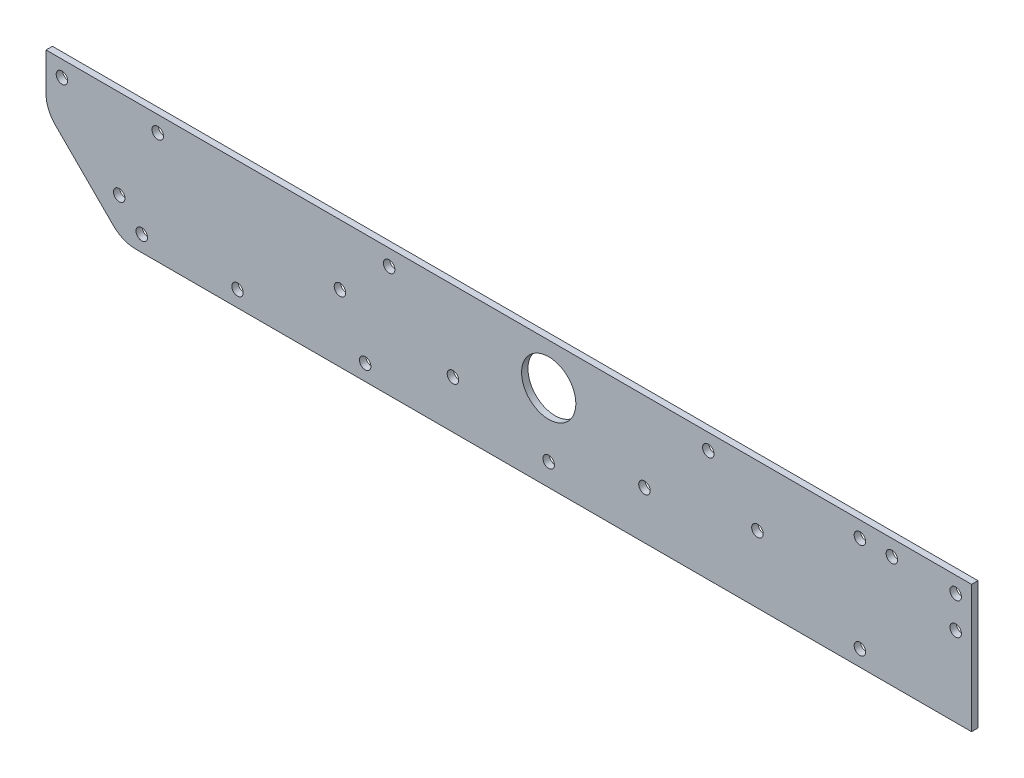
ISO-10303-21;
HEADER;
FILE_DESCRIPTION(('STEP AP214'),'2;1');
FILE_NAME('part.step','',(''),(''),'','','');
FILE_SCHEMA(('AUTOMOTIVE_DESIGN { 1 0 10303 214 1 1 1 1 }'));
ENDSEC;
DATA;
#1=APPLICATION_CONTEXT('core data for automotive mechanical design processes');
#2=APPLICATION_PROTOCOL_DEFINITION('international standard','automotive_design',2000,#1);
#3=PRODUCT_CONTEXT('',#1,'mechanical');
#4=PRODUCT('Part','Part','',(#3));
#5=PRODUCT_RELATED_PRODUCT_CATEGORY('part','',(#4));
#6=PRODUCT_DEFINITION_FORMATION('','',#4);
#7=PRODUCT_DEFINITION_CONTEXT('part definition',#1,'design');
#8=PRODUCT_DEFINITION('design','',#6,#7);
#9=PRODUCT_DEFINITION_SHAPE('','',#8);
#10=(LENGTH_UNIT() NAMED_UNIT(*) SI_UNIT(.MILLI.,.METRE.));
#11=(NAMED_UNIT(*) PLANE_ANGLE_UNIT() SI_UNIT($,.RADIAN.));
#12=(NAMED_UNIT(*) SI_UNIT($,.STERADIAN.) SOLID_ANGLE_UNIT());
#13=UNCERTAINTY_MEASURE_WITH_UNIT(LENGTH_MEASURE(1.E-05),#10,'distance_accuracy_value','');
#14=(GEOMETRIC_REPRESENTATION_CONTEXT(3) GLOBAL_UNCERTAINTY_ASSIGNED_CONTEXT((#13)) GLOBAL_UNIT_ASSIGNED_CONTEXT((#10,
#11,#12)) REPRESENTATION_CONTEXT('',''));
#15=CARTESIAN_POINT('',(0.,0.,0.));
#16=DIRECTION('',(0.,0.,1.));
#17=DIRECTION('',(1.,0.,0.));
#18=AXIS2_PLACEMENT_3D('',#15,#16,#17);
#19=CARTESIAN_POINT('',(0.,0.,2.54));
#20=DIRECTION('',(0.,0.,1.));
#21=DIRECTION('',(1.,0.,0.));
#22=AXIS2_PLACEMENT_3D('',#19,#20,#21);
#23=PLANE('',#22);
#24=CARTESIAN_POINT('',(-44.45,44.45,2.54));
#25=DIRECTION('',(0.,0.,1.));
#26=DIRECTION('',(1.,0.,0.));
#27=AXIS2_PLACEMENT_3D('',#24,#25,#26);
#28=CIRCLE('',#27,2.286);
#29=CARTESIAN_POINT('',(-42.164,44.45,2.54));
#30=VERTEX_POINT('',#29);
#31=EDGE_CURVE('E495',#30,#30,#28,.T.);
#32=ORIENTED_EDGE('',*,*,#31,.F.);
#33=EDGE_LOOP('',(#32));
#34=FACE_BOUND('',#33,.T.);
#35=CARTESIAN_POINT('',(-31.75,44.45,2.54));
#36=DIRECTION('',(0.,0.,1.));
#37=DIRECTION('',(1.,0.,0.));
#38=AXIS2_PLACEMENT_3D('',#35,#36,#37);
#39=CIRCLE('',#38,2.286);
#40=CARTESIAN_POINT('',(-29.464,44.45,2.54));
#41=VERTEX_POINT('',#40);
#42=EDGE_CURVE('E496',#41,#41,#39,.T.);
#43=ORIENTED_EDGE('',*,*,#42,.F.);
#44=EDGE_LOOP('',(#43));
#45=FACE_BOUND('',#44,.T.);
#46=CARTESIAN_POINT('',(-6.35,44.45,2.54));
#47=DIRECTION('',(0.,0.,1.));
#48=DIRECTION('',(1.,0.,0.));
#49=AXIS2_PLACEMENT_3D('',#46,#47,#48);
#50=CIRCLE('',#49,2.286);
#51=CARTESIAN_POINT('',(-4.064,44.45,2.54));
#52=VERTEX_POINT('',#51);
#53=EDGE_CURVE('E506',#52,#52,#50,.T.);
#54=ORIENTED_EDGE('',*,*,#53,.F.);
#55=EDGE_LOOP('',(#54));
#56=FACE_BOUND('',#55,.T.);
#57=CARTESIAN_POINT('',(-6.35,31.75,2.54));
#58=DIRECTION('',(0.,0.,1.));
#59=DIRECTION('',(1.,0.,0.));
#60=AXIS2_PLACEMENT_3D('',#57,#58,#59);
#61=CIRCLE('',#60,2.286);
#62=CARTESIAN_POINT('',(-4.064,31.75,2.54));
#63=VERTEX_POINT('',#62);
#64=EDGE_CURVE('E512',#63,#63,#61,.T.);
#65=ORIENTED_EDGE('',*,*,#64,.F.);
#66=EDGE_LOOP('',(#65));
#67=FACE_BOUND('',#66,.T.);
#68=CARTESIAN_POINT('',(-104.775,44.45,2.54));
#69=DIRECTION('',(0.,0.,1.));
#70=DIRECTION('',(1.,0.,0.));
#71=AXIS2_PLACEMENT_3D('',#68,#69,#70);
#72=CIRCLE('',#71,2.28599999999999);
#73=CARTESIAN_POINT('',(-102.489,44.45,2.54));
#74=VERTEX_POINT('',#73);
#75=EDGE_CURVE('E520',#74,#74,#72,.T.);
#76=ORIENTED_EDGE('',*,*,#75,.F.);
#77=EDGE_LOOP('',(#76));
#78=FACE_BOUND('',#77,.T.);
#79=CARTESIAN_POINT('',(-231.775,44.45,2.54));
#80=DIRECTION('',(0.,0.,1.));
#81=DIRECTION('',(1.,0.,0.));
#82=AXIS2_PLACEMENT_3D('',#79,#80,#81);
#83=CIRCLE('',#82,2.28600000000001);
#84=CARTESIAN_POINT('',(-229.489,44.45,2.54));
#85=VERTEX_POINT('',#84);
#86=EDGE_CURVE('E523',#85,#85,#83,.T.);
#87=ORIENTED_EDGE('',*,*,#86,.F.);
#88=EDGE_LOOP('',(#87));
#89=FACE_BOUND('',#88,.T.);
#90=CARTESIAN_POINT('',(-168.275,8.89000000000002,2.54));
#91=DIRECTION('',(0.,0.,1.));
#92=DIRECTION('',(1.,0.,0.));
#93=AXIS2_PLACEMENT_3D('',#90,#91,#92);
#94=CIRCLE('',#93,2.28600000000001);
#95=CARTESIAN_POINT('',(-165.989,8.89000000000002,2.54));
#96=VERTEX_POINT('',#95);
#97=EDGE_CURVE('E529',#96,#96,#94,.T.);
#98=ORIENTED_EDGE('',*,*,#97,.F.);
#99=EDGE_LOOP('',(#98));
#100=FACE_BOUND('',#99,.T.);
#101=DIRECTION('',(-0.707106781186547,0.707106781186548,0.));
#102=VECTOR('',#101,1.);
#103=CARTESIAN_POINT('',(-388.62,50.8,2.54));
#104=LINE('',#103,#102);
#105=CARTESIAN_POINT('',(-341.539743878931,3.71974387893083,2.54));
#106=VERTEX_POINT('',#105);
#107=CARTESIAN_POINT('',(-364.580256121069,26.7602561210692,2.54));
#108=VERTEX_POINT('',#107);
#109=EDGE_CURVE('E151',#106,#108,#104,.T.);
#110=ORIENTED_EDGE('',*,*,#109,.F.);
#111=CARTESIAN_POINT('',(-332.559487757862,12.7,2.54));
#112=DIRECTION('',(0.,0.,1.));
#113=DIRECTION('',(1.,0.,0.));
#114=AXIS2_PLACEMENT_3D('',#111,#112,#113);
#115=CIRCLE('',#114,12.7);
#116=CARTESIAN_POINT('',(-332.559487757862,0.,2.54));
#117=VERTEX_POINT('',#116);
#118=EDGE_CURVE('E136',#106,#117,#115,.T.);
#119=ORIENTED_EDGE('',*,*,#118,.T.);
#120=DIRECTION('',(1.,0.,0.));
#121=VECTOR('',#120,1.);
#122=CARTESIAN_POINT('',(0.,0.,2.54));
#123=LINE('',#122,#121);
#124=CARTESIAN_POINT('',(0.,0.,2.54));
#125=VERTEX_POINT('',#124);
#126=EDGE_CURVE('E115',#117,#125,#123,.T.);
#127=ORIENTED_EDGE('',*,*,#126,.T.);
#128=DIRECTION('',(0.,1.,0.));
#129=VECTOR('',#128,1.);
#130=CARTESIAN_POINT('',(0.,0.,2.54));
#131=LINE('',#130,#129);
#132=CARTESIAN_POINT('',(-1.05408619169834E-12,50.8,2.54));
#133=VERTEX_POINT('',#132);
#134=EDGE_CURVE('E110',#125,#133,#131,.T.);
#135=ORIENTED_EDGE('',*,*,#134,.T.);
#136=DIRECTION('',(-1.,0.,0.));
#137=VECTOR('',#136,1.);
#138=CARTESIAN_POINT('',(-1.05408619169834E-12,50.8,2.54));
#139=LINE('',#138,#137);
#140=CARTESIAN_POINT('',(-368.3,50.8,2.54));
#141=VERTEX_POINT('',#140);
#142=EDGE_CURVE('E98',#133,#141,#139,.T.);
#143=ORIENTED_EDGE('',*,*,#142,.T.);
#144=DIRECTION('',(0.,-1.,0.));
#145=VECTOR('',#144,1.);
#146=CARTESIAN_POINT('',(-368.3,0.,2.54));
#147=LINE('',#146,#145);
#148=CARTESIAN_POINT('',(-368.3,35.7405122421383,2.54));
#149=VERTEX_POINT('',#148);
#150=EDGE_CURVE('E109',#141,#149,#147,.T.);
#151=ORIENTED_EDGE('',*,*,#150,.T.);
#152=CARTESIAN_POINT('',(-355.6,35.7405122421383,2.54));
#153=DIRECTION('',(0.,0.,1.));
#154=DIRECTION('',(1.,0.,0.));
#155=AXIS2_PLACEMENT_3D('',#152,#153,#154);
#156=CIRCLE('',#155,12.7);
#157=EDGE_CURVE('E134',#149,#108,#156,.T.);
#158=ORIENTED_EDGE('',*,*,#157,.T.);
#159=EDGE_LOOP('',(#110,#119,#127,#135,#143,#151,#158));
#160=FACE_BOUND('',#159,.T.);
#161=CARTESIAN_POINT('',(-323.85,44.45,2.54));
#162=DIRECTION('',(0.,0.,1.));
#163=DIRECTION('',(1.,0.,0.));
#164=AXIS2_PLACEMENT_3D('',#161,#162,#163);
#165=CIRCLE('',#164,2.28600000000004);
#166=CARTESIAN_POINT('',(-321.564,44.45,2.54));
#167=VERTEX_POINT('',#166);
#168=EDGE_CURVE('E540',#167,#167,#165,.T.);
#169=ORIENTED_EDGE('',*,*,#168,.F.);
#170=EDGE_LOOP('',(#169));
#171=FACE_BOUND('',#170,.T.);
#172=CARTESIAN_POINT('',(-241.3,6.34999999999999,2.54));
#173=DIRECTION('',(0.,0.,1.));
#174=DIRECTION('',(1.,0.,0.));
#175=AXIS2_PLACEMENT_3D('',#172,#173,#174);
#176=CIRCLE('',#175,2.28600000000004);
#177=CARTESIAN_POINT('',(-239.014,6.34999999999999,2.54));
#178=VERTEX_POINT('',#177);
#179=EDGE_CURVE('E552',#178,#178,#176,.T.);
#180=ORIENTED_EDGE('',*,*,#179,.F.);
#181=EDGE_LOOP('',(#180));
#182=FACE_BOUND('',#181,.T.);
#183=CARTESIAN_POINT('',(-85.217,26.67,2.54));
#184=DIRECTION('',(0.,0.,1.));
#185=DIRECTION('',(-1.,0.,0.));
#186=AXIS2_PLACEMENT_3D('',#183,#184,#185);
#187=CIRCLE('',#186,2.28600000000004);
#188=CARTESIAN_POINT('',(-87.503,26.67,2.54));
#189=VERTEX_POINT('',#188);
#190=EDGE_CURVE('E564',#189,#189,#187,.T.);
#191=ORIENTED_EDGE('',*,*,#190,.F.);
#192=EDGE_LOOP('',(#191));
#193=FACE_BOUND('',#192,.T.);
#194=CARTESIAN_POINT('',(-168.275,34.29,2.54));
#195=DIRECTION('',(0.,0.,1.));
#196=DIRECTION('',(1.,0.,0.));
#197=AXIS2_PLACEMENT_3D('',#194,#195,#196);
#198=CIRCLE('',#197,10.795);
#199=CARTESIAN_POINT('',(-157.48,34.29,2.54));
#200=VERTEX_POINT('',#199);
#201=EDGE_CURVE('E576',#200,#200,#198,.T.);
#202=ORIENTED_EDGE('',*,*,#201,.F.);
#203=EDGE_LOOP('',(#202));
#204=FACE_BOUND('',#203,.T.);
#205=CARTESIAN_POINT('',(-292.1,6.34999999999999,2.54));
#206=DIRECTION('',(0.,0.,1.));
#207=DIRECTION('',(1.,0.,0.));
#208=AXIS2_PLACEMENT_3D('',#205,#206,#207);
#209=CIRCLE('',#208,2.28600000000004);
#210=CARTESIAN_POINT('',(-289.814,6.34999999999999,2.54));
#211=VERTEX_POINT('',#210);
#212=EDGE_CURVE('E588',#211,#211,#209,.T.);
#213=ORIENTED_EDGE('',*,*,#212,.F.);
#214=EDGE_LOOP('',(#213));
#215=FACE_BOUND('',#214,.T.);
#216=CARTESIAN_POINT('',(-44.45,6.34999999999999,2.54));
#217=DIRECTION('',(0.,0.,1.));
#218=DIRECTION('',(1.,0.,0.));
#219=AXIS2_PLACEMENT_3D('',#216,#217,#218);
#220=CIRCLE('',#219,2.28599999999999);
#221=CARTESIAN_POINT('',(-42.164,6.34999999999999,2.54));
#222=VERTEX_POINT('',#221);
#223=EDGE_CURVE('E160',#222,#222,#220,.T.);
#224=ORIENTED_EDGE('',*,*,#223,.F.);
#225=EDGE_LOOP('',(#224));
#226=FACE_BOUND('',#225,.T.);
#227=CARTESIAN_POINT('',(-206.375,19.050000000001,2.54));
#228=DIRECTION('',(0.,0.,1.));
#229=DIRECTION('',(1.,0.,0.));
#230=AXIS2_PLACEMENT_3D('',#227,#228,#229);
#231=CIRCLE('',#230,2.28600000000001);
#232=CARTESIAN_POINT('',(-204.089,19.050000000001,2.54));
#233=VERTEX_POINT('',#232);
#234=EDGE_CURVE('E594',#233,#233,#231,.T.);
#235=ORIENTED_EDGE('',*,*,#234,.F.);
#236=EDGE_LOOP('',(#235));
#237=FACE_BOUND('',#236,.T.);
#238=CARTESIAN_POINT('',(-130.175,19.050000000001,2.54));
#239=DIRECTION('',(0.,0.,1.));
#240=DIRECTION('',(1.,0.,0.));
#241=AXIS2_PLACEMENT_3D('',#238,#239,#240);
#242=CIRCLE('',#241,2.28600000000001);
#243=CARTESIAN_POINT('',(-127.889,19.050000000001,2.54));
#244=VERTEX_POINT('',#243);
#245=EDGE_CURVE('E582',#244,#244,#242,.T.);
#246=ORIENTED_EDGE('',*,*,#245,.F.);
#247=EDGE_LOOP('',(#246));
#248=FACE_BOUND('',#247,.T.);
#249=CARTESIAN_POINT('',(-251.333,26.67,2.54));
#250=DIRECTION('',(0.,0.,1.));
#251=DIRECTION('',(1.,0.,0.));
#252=AXIS2_PLACEMENT_3D('',#249,#250,#251);
#253=CIRCLE('',#252,2.28600000000004);
#254=CARTESIAN_POINT('',(-249.047,26.67,2.54));
#255=VERTEX_POINT('',#254);
#256=EDGE_CURVE('E570',#255,#255,#253,.T.);
#257=ORIENTED_EDGE('',*,*,#256,.F.);
#258=EDGE_LOOP('',(#257));
#259=FACE_BOUND('',#258,.T.);
#260=CARTESIAN_POINT('',(-361.95,44.45,2.54));
#261=DIRECTION('',(0.,0.,1.));
#262=DIRECTION('',(1.,0.,0.));
#263=AXIS2_PLACEMENT_3D('',#260,#261,#262);
#264=CIRCLE('',#263,2.28600000000004);
#265=CARTESIAN_POINT('',(-359.664,44.45,2.54));
#266=VERTEX_POINT('',#265);
#267=EDGE_CURVE('E558',#266,#266,#264,.T.);
#268=ORIENTED_EDGE('',*,*,#267,.F.);
#269=EDGE_LOOP('',(#268));
#270=FACE_BOUND('',#269,.T.);
#271=CARTESIAN_POINT('',(-330.2,6.3499999999992,2.54));
#272=DIRECTION('',(0.,0.,1.));
#273=DIRECTION('',(1.,0.,0.));
#274=AXIS2_PLACEMENT_3D('',#271,#272,#273);
#275=CIRCLE('',#274,2.28600000000004);
#276=CARTESIAN_POINT('',(-327.914,6.3499999999992,2.54));
#277=VERTEX_POINT('',#276);
#278=EDGE_CURVE('E546',#277,#277,#275,.T.);
#279=ORIENTED_EDGE('',*,*,#278,.F.);
#280=EDGE_LOOP('',(#279));
#281=FACE_BOUND('',#280,.T.);
#282=CARTESIAN_POINT('',(-339.180256121069,15.3302561210692,2.54));
#283=DIRECTION('',(0.,0.,1.));
#284=DIRECTION('',(1.,0.,0.));
#285=AXIS2_PLACEMENT_3D('',#282,#283,#284);
#286=CIRCLE('',#285,2.28600000000004);
#287=CARTESIAN_POINT('',(-336.894256121069,15.3302561210692,2.54));
#288=VERTEX_POINT('',#287);
#289=EDGE_CURVE('E534',#288,#288,#286,.T.);
#290=ORIENTED_EDGE('',*,*,#289,.F.);
#291=EDGE_LOOP('',(#290));
#292=FACE_BOUND('',#291,.T.);
#293=ADVANCED_FACE('F36',(#34,#45,#56,#67,#78,#89,#100,#160,#171,#182,#193,#204,#215,#226,#237,
#248,#259,#270,#281,#292),#23,.T.);
#294=CARTESIAN_POINT('',(0.,0.,0.));
#295=DIRECTION('',(0.,0.,1.));
#296=DIRECTION('',(1.,0.,0.));
#297=AXIS2_PLACEMENT_3D('',#294,#295,#296);
#298=PLANE('',#297);
#299=CARTESIAN_POINT('',(-44.45,44.45,0.));
#300=DIRECTION('',(0.,0.,1.));
#301=DIRECTION('',(1.,0.,0.));
#302=AXIS2_PLACEMENT_3D('',#299,#300,#301);
#303=CIRCLE('',#302,2.286);
#304=CARTESIAN_POINT('',(-42.164,44.45,0.));
#305=VERTEX_POINT('',#304);
#306=EDGE_CURVE('E493',#305,#305,#303,.T.);
#307=ORIENTED_EDGE('',*,*,#306,.T.);
#308=EDGE_LOOP('',(#307));
#309=FACE_BOUND('',#308,.T.);
#310=CARTESIAN_POINT('',(-31.75,44.45,0.));
#311=DIRECTION('',(0.,0.,1.));
#312=DIRECTION('',(1.,0.,0.));
#313=AXIS2_PLACEMENT_3D('',#310,#311,#312);
#314=CIRCLE('',#313,2.286);
#315=CARTESIAN_POINT('',(-29.464,44.45,0.));
#316=VERTEX_POINT('',#315);
#317=EDGE_CURVE('E501',#316,#316,#314,.T.);
#318=ORIENTED_EDGE('',*,*,#317,.T.);
#319=EDGE_LOOP('',(#318));
#320=FACE_BOUND('',#319,.T.);
#321=CARTESIAN_POINT('',(-6.35,44.45,0.));
#322=DIRECTION('',(0.,0.,1.));
#323=DIRECTION('',(1.,0.,0.));
#324=AXIS2_PLACEMENT_3D('',#321,#322,#323);
#325=CIRCLE('',#324,2.286);
#326=CARTESIAN_POINT('',(-4.064,44.45,0.));
#327=VERTEX_POINT('',#326);
#328=EDGE_CURVE('E509',#327,#327,#325,.T.);
#329=ORIENTED_EDGE('',*,*,#328,.T.);
#330=EDGE_LOOP('',(#329));
#331=FACE_BOUND('',#330,.T.);
#332=CARTESIAN_POINT('',(-6.35,31.75,0.));
#333=DIRECTION('',(0.,0.,1.));
#334=DIRECTION('',(1.,0.,0.));
#335=AXIS2_PLACEMENT_3D('',#332,#333,#334);
#336=CIRCLE('',#335,2.286);
#337=CARTESIAN_POINT('',(-4.064,31.75,0.));
#338=VERTEX_POINT('',#337);
#339=EDGE_CURVE('E515',#338,#338,#336,.T.);
#340=ORIENTED_EDGE('',*,*,#339,.T.);
#341=EDGE_LOOP('',(#340));
#342=FACE_BOUND('',#341,.T.);
#343=CARTESIAN_POINT('',(-104.775,44.45,0.));
#344=DIRECTION('',(0.,0.,1.));
#345=DIRECTION('',(1.,0.,0.));
#346=AXIS2_PLACEMENT_3D('',#343,#344,#345);
#347=CIRCLE('',#346,2.28599999999999);
#348=CARTESIAN_POINT('',(-102.489,44.45,0.));
#349=VERTEX_POINT('',#348);
#350=EDGE_CURVE('E168',#349,#349,#347,.T.);
#351=ORIENTED_EDGE('',*,*,#350,.T.);
#352=EDGE_LOOP('',(#351));
#353=FACE_BOUND('',#352,.T.);
#354=CARTESIAN_POINT('',(-231.775,44.45,0.));
#355=DIRECTION('',(0.,0.,1.));
#356=DIRECTION('',(1.,0.,0.));
#357=AXIS2_PLACEMENT_3D('',#354,#355,#356);
#358=CIRCLE('',#357,2.28600000000001);
#359=CARTESIAN_POINT('',(-229.489,44.45,0.));
#360=VERTEX_POINT('',#359);
#361=EDGE_CURVE('E526',#360,#360,#358,.T.);
#362=ORIENTED_EDGE('',*,*,#361,.T.);
#363=EDGE_LOOP('',(#362));
#364=FACE_BOUND('',#363,.T.);
#365=CARTESIAN_POINT('',(-168.275,8.89000000000002,0.));
#366=DIRECTION('',(0.,0.,1.));
#367=DIRECTION('',(1.,0.,0.));
#368=AXIS2_PLACEMENT_3D('',#365,#366,#367);
#369=CIRCLE('',#368,2.28600000000001);
#370=CARTESIAN_POINT('',(-165.989,8.89000000000002,0.));
#371=VERTEX_POINT('',#370);
#372=EDGE_CURVE('E498',#371,#371,#369,.T.);
#373=ORIENTED_EDGE('',*,*,#372,.T.);
#374=EDGE_LOOP('',(#373));
#375=FACE_BOUND('',#374,.T.);
#376=DIRECTION('',(1.,0.,0.));
#377=VECTOR('',#376,1.);
#378=CARTESIAN_POINT('',(0.,0.,0.));
#379=LINE('',#378,#377);
#380=CARTESIAN_POINT('',(-332.559487757862,0.,0.));
#381=VERTEX_POINT('',#380);
#382=CARTESIAN_POINT('',(0.,0.,0.));
#383=VERTEX_POINT('',#382);
#384=EDGE_CURVE('E119',#381,#383,#379,.T.);
#385=ORIENTED_EDGE('',*,*,#384,.F.);
#386=CARTESIAN_POINT('',(-332.559487757862,12.7,0.));
#387=DIRECTION('',(0.,0.,1.));
#388=DIRECTION('',(1.,0.,0.));
#389=AXIS2_PLACEMENT_3D('',#386,#387,#388);
#390=CIRCLE('',#389,12.7);
#391=CARTESIAN_POINT('',(-341.539743878931,3.71974387893083,0.));
#392=VERTEX_POINT('',#391);
#393=EDGE_CURVE('E44',#381,#392,#390,.F.);
#394=ORIENTED_EDGE('',*,*,#393,.T.);
#395=DIRECTION('',(-0.707106781186547,0.707106781186548,0.));
#396=VECTOR('',#395,1.);
#397=CARTESIAN_POINT('',(-388.62,50.8,0.));
#398=LINE('',#397,#396);
#399=CARTESIAN_POINT('',(-364.580256121069,26.7602561210692,0.));
#400=VERTEX_POINT('',#399);
#401=EDGE_CURVE('E143',#392,#400,#398,.T.);
#402=ORIENTED_EDGE('',*,*,#401,.T.);
#403=CARTESIAN_POINT('',(-355.6,35.7405122421383,0.));
#404=DIRECTION('',(0.,0.,1.));
#405=DIRECTION('',(1.,0.,0.));
#406=AXIS2_PLACEMENT_3D('',#403,#404,#405);
#407=CIRCLE('',#406,12.7);
#408=CARTESIAN_POINT('',(-368.3,35.7405122421383,0.));
#409=VERTEX_POINT('',#408);
#410=EDGE_CURVE('E51',#400,#409,#407,.F.);
#411=ORIENTED_EDGE('',*,*,#410,.T.);
#412=DIRECTION('',(0.,-1.,0.));
#413=VECTOR('',#412,1.);
#414=CARTESIAN_POINT('',(-368.3,0.,0.));
#415=LINE('',#414,#413);
#416=CARTESIAN_POINT('',(-368.3,50.8,0.));
#417=VERTEX_POINT('',#416);
#418=EDGE_CURVE('E162',#417,#409,#415,.T.);
#419=ORIENTED_EDGE('',*,*,#418,.F.);
#420=DIRECTION('',(-1.,0.,0.));
#421=VECTOR('',#420,1.);
#422=CARTESIAN_POINT('',(-1.05408619169834E-12,50.8,0.));
#423=LINE('',#422,#421);
#424=CARTESIAN_POINT('',(-1.05408619169834E-12,50.8,0.));
#425=VERTEX_POINT('',#424);
#426=EDGE_CURVE('E159',#425,#417,#423,.T.);
#427=ORIENTED_EDGE('',*,*,#426,.F.);
#428=DIRECTION('',(0.,1.,0.));
#429=VECTOR('',#428,1.);
#430=CARTESIAN_POINT('',(0.,0.,0.));
#431=LINE('',#430,#429);
#432=EDGE_CURVE('E123',#383,#425,#431,.T.);
#433=ORIENTED_EDGE('',*,*,#432,.F.);
#434=EDGE_LOOP('',(#385,#394,#402,#411,#419,#427,#433));
#435=FACE_BOUND('',#434,.T.);
#436=CARTESIAN_POINT('',(-44.45,6.34999999999999,0.));
#437=DIRECTION('',(0.,0.,1.));
#438=DIRECTION('',(1.,0.,0.));
#439=AXIS2_PLACEMENT_3D('',#436,#437,#438);
#440=CIRCLE('',#439,2.28599999999999);
#441=CARTESIAN_POINT('',(-42.164,6.34999999999999,0.));
#442=VERTEX_POINT('',#441);
#443=EDGE_CURVE('E597',#442,#442,#440,.T.);
#444=ORIENTED_EDGE('',*,*,#443,.T.);
#445=EDGE_LOOP('',(#444));
#446=FACE_BOUND('',#445,.T.);
#447=CARTESIAN_POINT('',(-206.375,19.050000000001,0.));
#448=DIRECTION('',(0.,0.,1.));
#449=DIRECTION('',(1.,0.,0.));
#450=AXIS2_PLACEMENT_3D('',#447,#448,#449);
#451=CIRCLE('',#450,2.28600000000001);
#452=CARTESIAN_POINT('',(-204.089,19.050000000001,0.));
#453=VERTEX_POINT('',#452);
#454=EDGE_CURVE('E591',#453,#453,#451,.T.);
#455=ORIENTED_EDGE('',*,*,#454,.T.);
#456=EDGE_LOOP('',(#455));
#457=FACE_BOUND('',#456,.T.);
#458=CARTESIAN_POINT('',(-292.1,6.34999999999999,0.));
#459=DIRECTION('',(0.,0.,1.));
#460=DIRECTION('',(1.,0.,0.));
#461=AXIS2_PLACEMENT_3D('',#458,#459,#460);
#462=CIRCLE('',#461,2.28600000000004);
#463=CARTESIAN_POINT('',(-289.814,6.34999999999999,0.));
#464=VERTEX_POINT('',#463);
#465=EDGE_CURVE('E585',#464,#464,#462,.T.);
#466=ORIENTED_EDGE('',*,*,#465,.T.);
#467=EDGE_LOOP('',(#466));
#468=FACE_BOUND('',#467,.T.);
#469=CARTESIAN_POINT('',(-130.175,19.050000000001,0.));
#470=DIRECTION('',(0.,0.,1.));
#471=DIRECTION('',(1.,0.,0.));
#472=AXIS2_PLACEMENT_3D('',#469,#470,#471);
#473=CIRCLE('',#472,2.28600000000001);
#474=CARTESIAN_POINT('',(-127.889,19.050000000001,0.));
#475=VERTEX_POINT('',#474);
#476=EDGE_CURVE('E579',#475,#475,#473,.T.);
#477=ORIENTED_EDGE('',*,*,#476,.T.);
#478=EDGE_LOOP('',(#477));
#479=FACE_BOUND('',#478,.T.);
#480=CARTESIAN_POINT('',(-168.275,34.29,0.));
#481=DIRECTION('',(0.,0.,1.));
#482=DIRECTION('',(1.,0.,0.));
#483=AXIS2_PLACEMENT_3D('',#480,#481,#482);
#484=CIRCLE('',#483,10.795);
#485=CARTESIAN_POINT('',(-157.48,34.29,0.));
#486=VERTEX_POINT('',#485);
#487=EDGE_CURVE('E573',#486,#486,#484,.T.);
#488=ORIENTED_EDGE('',*,*,#487,.T.);
#489=EDGE_LOOP('',(#488));
#490=FACE_BOUND('',#489,.T.);
#491=CARTESIAN_POINT('',(-251.333,26.67,0.));
#492=DIRECTION('',(0.,0.,1.));
#493=DIRECTION('',(1.,0.,0.));
#494=AXIS2_PLACEMENT_3D('',#491,#492,#493);
#495=CIRCLE('',#494,2.28600000000004);
#496=CARTESIAN_POINT('',(-249.047,26.67,0.));
#497=VERTEX_POINT('',#496);
#498=EDGE_CURVE('E567',#497,#497,#495,.T.);
#499=ORIENTED_EDGE('',*,*,#498,.T.);
#500=EDGE_LOOP('',(#499));
#501=FACE_BOUND('',#500,.T.);
#502=CARTESIAN_POINT('',(-85.217,26.67,0.));
#503=DIRECTION('',(0.,0.,1.));
#504=DIRECTION('',(-1.,0.,0.));
#505=AXIS2_PLACEMENT_3D('',#502,#503,#504);
#506=CIRCLE('',#505,2.28600000000004);
#507=CARTESIAN_POINT('',(-87.503,26.67,0.));
#508=VERTEX_POINT('',#507);
#509=EDGE_CURVE('E561',#508,#508,#506,.T.);
#510=ORIENTED_EDGE('',*,*,#509,.T.);
#511=EDGE_LOOP('',(#510));
#512=FACE_BOUND('',#511,.T.);
#513=CARTESIAN_POINT('',(-361.95,44.45,0.));
#514=DIRECTION('',(0.,0.,1.));
#515=DIRECTION('',(1.,0.,0.));
#516=AXIS2_PLACEMENT_3D('',#513,#514,#515);
#517=CIRCLE('',#516,2.28600000000004);
#518=CARTESIAN_POINT('',(-359.664,44.45,0.));
#519=VERTEX_POINT('',#518);
#520=EDGE_CURVE('E555',#519,#519,#517,.T.);
#521=ORIENTED_EDGE('',*,*,#520,.T.);
#522=EDGE_LOOP('',(#521));
#523=FACE_BOUND('',#522,.T.);
#524=CARTESIAN_POINT('',(-241.3,6.34999999999999,0.));
#525=DIRECTION('',(0.,0.,1.));
#526=DIRECTION('',(1.,0.,0.));
#527=AXIS2_PLACEMENT_3D('',#524,#525,#526);
#528=CIRCLE('',#527,2.28600000000004);
#529=CARTESIAN_POINT('',(-239.014,6.34999999999999,0.));
#530=VERTEX_POINT('',#529);
#531=EDGE_CURVE('E549',#530,#530,#528,.T.);
#532=ORIENTED_EDGE('',*,*,#531,.T.);
#533=EDGE_LOOP('',(#532));
#534=FACE_BOUND('',#533,.T.);
#535=CARTESIAN_POINT('',(-330.2,6.3499999999992,0.));
#536=DIRECTION('',(0.,0.,1.));
#537=DIRECTION('',(1.,0.,0.));
#538=AXIS2_PLACEMENT_3D('',#535,#536,#537);
#539=CIRCLE('',#538,2.28600000000004);
#540=CARTESIAN_POINT('',(-327.914,6.3499999999992,0.));
#541=VERTEX_POINT('',#540);
#542=EDGE_CURVE('E543',#541,#541,#539,.T.);
#543=ORIENTED_EDGE('',*,*,#542,.T.);
#544=EDGE_LOOP('',(#543));
#545=FACE_BOUND('',#544,.T.);
#546=CARTESIAN_POINT('',(-323.85,44.45,0.));
#547=DIRECTION('',(0.,0.,1.));
#548=DIRECTION('',(1.,0.,0.));
#549=AXIS2_PLACEMENT_3D('',#546,#547,#548);
#550=CIRCLE('',#549,2.28600000000004);
#551=CARTESIAN_POINT('',(-321.564,44.45,0.));
#552=VERTEX_POINT('',#551);
#553=EDGE_CURVE('E537',#552,#552,#550,.T.);
#554=ORIENTED_EDGE('',*,*,#553,.T.);
#555=EDGE_LOOP('',(#554));
#556=FACE_BOUND('',#555,.T.);
#557=CARTESIAN_POINT('',(-339.180256121069,15.3302561210692,0.));
#558=DIRECTION('',(0.,0.,1.));
#559=DIRECTION('',(1.,0.,0.));
#560=AXIS2_PLACEMENT_3D('',#557,#558,#559);
#561=CIRCLE('',#560,2.28600000000004);
#562=CARTESIAN_POINT('',(-336.894256121069,15.3302561210692,0.));
#563=VERTEX_POINT('',#562);
#564=EDGE_CURVE('E150',#563,#563,#561,.T.);
#565=ORIENTED_EDGE('',*,*,#564,.T.);
#566=EDGE_LOOP('',(#565));
#567=FACE_BOUND('',#566,.T.);
#568=ADVANCED_FACE('F141',(#309,#320,#331,#342,#353,#364,#375,#435,#446,#457,#468,#479,#490,
#501,#512,#523,#534,#545,#556,#567),#298,.F.);
#569=CARTESIAN_POINT('',(0.,0.,2.54));
#570=DIRECTION('',(-1.,0.,0.));
#571=DIRECTION('',(0.,-1.,0.));
#572=AXIS2_PLACEMENT_3D('',#569,#570,#571);
#573=PLANE('',#572);
#574=ORIENTED_EDGE('',*,*,#432,.T.);
#575=DIRECTION('',(0.,0.,-1.));
#576=VECTOR('',#575,1.);
#577=CARTESIAN_POINT('',(-1.05408619169834E-12,50.8,2.54));
#578=LINE('',#577,#576);
#579=EDGE_CURVE('E102',#133,#425,#578,.T.);
#580=ORIENTED_EDGE('',*,*,#579,.F.);
#581=ORIENTED_EDGE('',*,*,#134,.F.);
#582=DIRECTION('',(0.,0.,-1.));
#583=VECTOR('',#582,1.);
#584=CARTESIAN_POINT('',(0.,0.,2.54));
#585=LINE('',#584,#583);
#586=EDGE_CURVE('E128',#125,#383,#585,.T.);
#587=ORIENTED_EDGE('',*,*,#586,.T.);
#588=EDGE_LOOP('',(#574,#580,#581,#587));
#589=FACE_BOUND('',#588,.T.);
#590=ADVANCED_FACE('F121',(#589),#573,.F.);
#591=CARTESIAN_POINT('',(-1.05408619169834E-12,50.8,2.54));
#592=DIRECTION('',(0.,-1.,0.));
#593=DIRECTION('',(1.,0.,0.));
#594=AXIS2_PLACEMENT_3D('',#591,#592,#593);
#595=PLANE('',#594);
#596=ORIENTED_EDGE('',*,*,#426,.T.);
#597=DIRECTION('',(0.,0.,-1.));
#598=VECTOR('',#597,1.);
#599=CARTESIAN_POINT('',(-368.3,50.8,2.54));
#600=LINE('',#599,#598);
#601=EDGE_CURVE('E105',#141,#417,#600,.T.);
#602=ORIENTED_EDGE('',*,*,#601,.F.);
#603=ORIENTED_EDGE('',*,*,#142,.F.);
#604=ORIENTED_EDGE('',*,*,#579,.T.);
#605=EDGE_LOOP('',(#596,#602,#603,#604));
#606=FACE_BOUND('',#605,.T.);
#607=ADVANCED_FACE('F100',(#606),#595,.F.);
#608=CARTESIAN_POINT('',(-368.3,0.,2.54));
#609=DIRECTION('',(1.,0.,0.));
#610=DIRECTION('',(0.,0.,-1.));
#611=AXIS2_PLACEMENT_3D('',#608,#609,#610);
#612=PLANE('',#611);
#613=ORIENTED_EDGE('',*,*,#418,.T.);
#614=DIRECTION('',(0.,0.,1.));
#615=VECTOR('',#614,1.);
#616=CARTESIAN_POINT('',(-368.3,35.7405122421383,2.54));
#617=LINE('',#616,#615);
#618=EDGE_CURVE('E11',#409,#149,#617,.T.);
#619=ORIENTED_EDGE('',*,*,#618,.T.);
#620=ORIENTED_EDGE('',*,*,#150,.F.);
#621=ORIENTED_EDGE('',*,*,#601,.T.);
#622=EDGE_LOOP('',(#613,#619,#620,#621));
#623=FACE_BOUND('',#622,.T.);
#624=ADVANCED_FACE('F165',(#623),#612,.F.);
#625=CARTESIAN_POINT('',(0.,0.,2.54));
#626=DIRECTION('',(0.,1.,0.));
#627=DIRECTION('',(-1.,0.,0.));
#628=AXIS2_PLACEMENT_3D('',#625,#626,#627);
#629=PLANE('',#628);
#630=ORIENTED_EDGE('',*,*,#126,.F.);
#631=DIRECTION('',(0.,0.,1.));
#632=VECTOR('',#631,1.);
#633=CARTESIAN_POINT('',(-332.559487757862,0.,2.54));
#634=LINE('',#633,#632);
#635=EDGE_CURVE('E59',#117,#381,#634,.F.);
#636=ORIENTED_EDGE('',*,*,#635,.T.);
#637=ORIENTED_EDGE('',*,*,#384,.T.);
#638=ORIENTED_EDGE('',*,*,#586,.F.);
#639=EDGE_LOOP('',(#630,#636,#637,#638));
#640=FACE_BOUND('',#639,.T.);
#641=ADVANCED_FACE('F154',(#640),#629,.F.);
#642=CARTESIAN_POINT('',(-44.45,6.34999999999999,2.54));
#643=DIRECTION('',(0.,0.,-1.));
#644=DIRECTION('',(-1.,0.,0.));
#645=AXIS2_PLACEMENT_3D('',#642,#643,#644);
#646=CYLINDRICAL_SURFACE('',#645,2.28599999999999);
#647=ORIENTED_EDGE('',*,*,#223,.T.);
#648=EDGE_LOOP('',(#647));
#649=FACE_BOUND('',#648,.T.);
#650=ORIENTED_EDGE('',*,*,#443,.F.);
#651=EDGE_LOOP('',(#650));
#652=FACE_BOUND('',#651,.T.);
#653=ADVANCED_FACE('F190',(#649,#652),#646,.F.);
#654=CARTESIAN_POINT('',(-206.375,19.050000000001,2.54));
#655=DIRECTION('',(0.,0.,-1.));
#656=DIRECTION('',(-1.,0.,0.));
#657=AXIS2_PLACEMENT_3D('',#654,#655,#656);
#658=CYLINDRICAL_SURFACE('',#657,2.28600000000001);
#659=ORIENTED_EDGE('',*,*,#234,.T.);
#660=EDGE_LOOP('',(#659));
#661=FACE_BOUND('',#660,.T.);
#662=ORIENTED_EDGE('',*,*,#454,.F.);
#663=EDGE_LOOP('',(#662));
#664=FACE_BOUND('',#663,.T.);
#665=ADVANCED_FACE('F224',(#661,#664),#658,.F.);
#666=CARTESIAN_POINT('',(-292.1,6.34999999999999,2.54));
#667=DIRECTION('',(0.,0.,-1.));
#668=DIRECTION('',(-1.,0.,0.));
#669=AXIS2_PLACEMENT_3D('',#666,#667,#668);
#670=CYLINDRICAL_SURFACE('',#669,2.28600000000004);
#671=ORIENTED_EDGE('',*,*,#212,.T.);
#672=EDGE_LOOP('',(#671));
#673=FACE_BOUND('',#672,.T.);
#674=ORIENTED_EDGE('',*,*,#465,.F.);
#675=EDGE_LOOP('',(#674));
#676=FACE_BOUND('',#675,.T.);
#677=ADVANCED_FACE('F231',(#673,#676),#670,.F.);
#678=CARTESIAN_POINT('',(-130.175,19.050000000001,2.54));
#679=DIRECTION('',(0.,0.,-1.));
#680=DIRECTION('',(-1.,0.,0.));
#681=AXIS2_PLACEMENT_3D('',#678,#679,#680);
#682=CYLINDRICAL_SURFACE('',#681,2.28600000000001);
#683=ORIENTED_EDGE('',*,*,#245,.T.);
#684=EDGE_LOOP('',(#683));
#685=FACE_BOUND('',#684,.T.);
#686=ORIENTED_EDGE('',*,*,#476,.F.);
#687=EDGE_LOOP('',(#686));
#688=FACE_BOUND('',#687,.T.);
#689=ADVANCED_FACE('F238',(#685,#688),#682,.F.);
#690=CARTESIAN_POINT('',(-168.275,34.29,2.54));
#691=DIRECTION('',(0.,0.,-1.));
#692=DIRECTION('',(-1.,0.,0.));
#693=AXIS2_PLACEMENT_3D('',#690,#691,#692);
#694=CYLINDRICAL_SURFACE('',#693,10.795);
#695=ORIENTED_EDGE('',*,*,#201,.T.);
#696=EDGE_LOOP('',(#695));
#697=FACE_BOUND('',#696,.T.);
#698=ORIENTED_EDGE('',*,*,#487,.F.);
#699=EDGE_LOOP('',(#698));
#700=FACE_BOUND('',#699,.T.);
#701=ADVANCED_FACE('F246',(#697,#700),#694,.F.);
#702=CARTESIAN_POINT('',(-251.333,26.67,2.54));
#703=DIRECTION('',(0.,0.,-1.));
#704=DIRECTION('',(-1.,0.,0.));
#705=AXIS2_PLACEMENT_3D('',#702,#703,#704);
#706=CYLINDRICAL_SURFACE('',#705,2.28600000000004);
#707=ORIENTED_EDGE('',*,*,#256,.T.);
#708=EDGE_LOOP('',(#707));
#709=FACE_BOUND('',#708,.T.);
#710=ORIENTED_EDGE('',*,*,#498,.F.);
#711=EDGE_LOOP('',(#710));
#712=FACE_BOUND('',#711,.T.);
#713=ADVANCED_FACE('F254',(#709,#712),#706,.F.);
#714=CARTESIAN_POINT('',(-85.217,26.67,2.54));
#715=DIRECTION('',(0.,0.,-1.));
#716=DIRECTION('',(-1.,0.,0.));
#717=AXIS2_PLACEMENT_3D('',#714,#715,#716);
#718=CYLINDRICAL_SURFACE('',#717,2.28600000000004);
#719=ORIENTED_EDGE('',*,*,#190,.T.);
#720=EDGE_LOOP('',(#719));
#721=FACE_BOUND('',#720,.T.);
#722=ORIENTED_EDGE('',*,*,#509,.F.);
#723=EDGE_LOOP('',(#722));
#724=FACE_BOUND('',#723,.T.);
#725=ADVANCED_FACE('F262',(#721,#724),#718,.F.);
#726=CARTESIAN_POINT('',(-361.95,44.45,2.54));
#727=DIRECTION('',(0.,0.,-1.));
#728=DIRECTION('',(-1.,0.,0.));
#729=AXIS2_PLACEMENT_3D('',#726,#727,#728);
#730=CYLINDRICAL_SURFACE('',#729,2.28600000000004);
#731=ORIENTED_EDGE('',*,*,#267,.T.);
#732=EDGE_LOOP('',(#731));
#733=FACE_BOUND('',#732,.T.);
#734=ORIENTED_EDGE('',*,*,#520,.F.);
#735=EDGE_LOOP('',(#734));
#736=FACE_BOUND('',#735,.T.);
#737=ADVANCED_FACE('F270',(#733,#736),#730,.F.);
#738=CARTESIAN_POINT('',(-241.3,6.34999999999999,2.54));
#739=DIRECTION('',(0.,0.,-1.));
#740=DIRECTION('',(-1.,0.,0.));
#741=AXIS2_PLACEMENT_3D('',#738,#739,#740);
#742=CYLINDRICAL_SURFACE('',#741,2.28600000000004);
#743=ORIENTED_EDGE('',*,*,#179,.T.);
#744=EDGE_LOOP('',(#743));
#745=FACE_BOUND('',#744,.T.);
#746=ORIENTED_EDGE('',*,*,#531,.F.);
#747=EDGE_LOOP('',(#746));
#748=FACE_BOUND('',#747,.T.);
#749=ADVANCED_FACE('F278',(#745,#748),#742,.F.);
#750=CARTESIAN_POINT('',(-330.2,6.3499999999992,2.54));
#751=DIRECTION('',(0.,0.,-1.));
#752=DIRECTION('',(-1.,0.,0.));
#753=AXIS2_PLACEMENT_3D('',#750,#751,#752);
#754=CYLINDRICAL_SURFACE('',#753,2.28600000000004);
#755=ORIENTED_EDGE('',*,*,#278,.T.);
#756=EDGE_LOOP('',(#755));
#757=FACE_BOUND('',#756,.T.);
#758=ORIENTED_EDGE('',*,*,#542,.F.);
#759=EDGE_LOOP('',(#758));
#760=FACE_BOUND('',#759,.T.);
#761=ADVANCED_FACE('F286',(#757,#760),#754,.F.);
#762=CARTESIAN_POINT('',(-323.85,44.45,2.54));
#763=DIRECTION('',(0.,0.,-1.));
#764=DIRECTION('',(-1.,0.,0.));
#765=AXIS2_PLACEMENT_3D('',#762,#763,#764);
#766=CYLINDRICAL_SURFACE('',#765,2.28600000000004);
#767=ORIENTED_EDGE('',*,*,#168,.T.);
#768=EDGE_LOOP('',(#767));
#769=FACE_BOUND('',#768,.T.);
#770=ORIENTED_EDGE('',*,*,#553,.F.);
#771=EDGE_LOOP('',(#770));
#772=FACE_BOUND('',#771,.T.);
#773=ADVANCED_FACE('F294',(#769,#772),#766,.F.);
#774=CARTESIAN_POINT('',(-339.180256121069,15.3302561210692,2.54));
#775=DIRECTION('',(0.,0.,-1.));
#776=DIRECTION('',(-1.,0.,0.));
#777=AXIS2_PLACEMENT_3D('',#774,#775,#776);
#778=CYLINDRICAL_SURFACE('',#777,2.28600000000004);
#779=ORIENTED_EDGE('',*,*,#289,.T.);
#780=EDGE_LOOP('',(#779));
#781=FACE_BOUND('',#780,.T.);
#782=ORIENTED_EDGE('',*,*,#564,.F.);
#783=EDGE_LOOP('',(#782));
#784=FACE_BOUND('',#783,.T.);
#785=ADVANCED_FACE('F302',(#781,#784),#778,.F.);
#786=CARTESIAN_POINT('',(-388.62,50.8,0.));
#787=DIRECTION('',(0.707106781186548,0.707106781186547,0.));
#788=DIRECTION('',(-0.707106781186547,0.707106781186548,0.));
#789=AXIS2_PLACEMENT_3D('',#786,#787,#788);
#790=PLANE('',#789);
#791=ORIENTED_EDGE('',*,*,#401,.F.);
#792=DIRECTION('',(0.,0.,1.));
#793=VECTOR('',#792,1.);
#794=CARTESIAN_POINT('',(-341.539743878931,3.71974387893081,0.));
#795=LINE('',#794,#793);
#796=EDGE_CURVE('E126',#392,#106,#795,.T.);
#797=ORIENTED_EDGE('',*,*,#796,.T.);
#798=ORIENTED_EDGE('',*,*,#109,.T.);
#799=DIRECTION('',(0.,0.,1.));
#800=VECTOR('',#799,1.);
#801=CARTESIAN_POINT('',(-364.580256121069,26.7602561210692,0.));
#802=LINE('',#801,#800);
#803=EDGE_CURVE('E124',#108,#400,#802,.F.);
#804=ORIENTED_EDGE('',*,*,#803,.T.);
#805=EDGE_LOOP('',(#791,#797,#798,#804));
#806=FACE_BOUND('',#805,.T.);
#807=ADVANCED_FACE('F147',(#806),#790,.F.);
#808=CARTESIAN_POINT('',(-332.559487757862,12.7,0.));
#809=DIRECTION('',(0.,0.,1.));
#810=DIRECTION('',(1.,0.,0.));
#811=AXIS2_PLACEMENT_3D('',#808,#809,#810);
#812=CYLINDRICAL_SURFACE('',#811,12.7);
#813=ORIENTED_EDGE('',*,*,#393,.F.);
#814=ORIENTED_EDGE('',*,*,#635,.F.);
#815=ORIENTED_EDGE('',*,*,#118,.F.);
#816=ORIENTED_EDGE('',*,*,#796,.F.);
#817=EDGE_LOOP('',(#813,#814,#815,#816));
#818=FACE_BOUND('',#817,.T.);
#819=ADVANCED_FACE('F153',(#818),#812,.T.);
#820=CARTESIAN_POINT('',(-355.6,35.7405122421383,2.54));
#821=DIRECTION('',(0.,0.,1.));
#822=DIRECTION('',(1.,0.,0.));
#823=AXIS2_PLACEMENT_3D('',#820,#821,#822);
#824=CYLINDRICAL_SURFACE('',#823,12.7);
#825=ORIENTED_EDGE('',*,*,#410,.F.);
#826=ORIENTED_EDGE('',*,*,#803,.F.);
#827=ORIENTED_EDGE('',*,*,#157,.F.);
#828=ORIENTED_EDGE('',*,*,#618,.F.);
#829=EDGE_LOOP('',(#825,#826,#827,#828));
#830=FACE_BOUND('',#829,.T.);
#831=ADVANCED_FACE('F38',(#830),#824,.T.);
#832=CARTESIAN_POINT('',(-168.275,8.89000000000002,0.));
#833=DIRECTION('',(0.,0.,1.));
#834=DIRECTION('',(1.,0.,0.));
#835=AXIS2_PLACEMENT_3D('',#832,#833,#834);
#836=CYLINDRICAL_SURFACE('',#835,2.28600000000001);
#837=ORIENTED_EDGE('',*,*,#372,.F.);
#838=EDGE_LOOP('',(#837));
#839=FACE_BOUND('',#838,.T.);
#840=ORIENTED_EDGE('',*,*,#97,.T.);
#841=EDGE_LOOP('',(#840));
#842=FACE_BOUND('',#841,.T.);
#843=ADVANCED_FACE('F171',(#839,#842),#836,.F.);
#844=CARTESIAN_POINT('',(-231.775,44.45,0.));
#845=DIRECTION('',(0.,0.,1.));
#846=DIRECTION('',(1.,0.,0.));
#847=AXIS2_PLACEMENT_3D('',#844,#845,#846);
#848=CYLINDRICAL_SURFACE('',#847,2.28600000000001);
#849=ORIENTED_EDGE('',*,*,#361,.F.);
#850=EDGE_LOOP('',(#849));
#851=FACE_BOUND('',#850,.T.);
#852=ORIENTED_EDGE('',*,*,#86,.T.);
#853=EDGE_LOOP('',(#852));
#854=FACE_BOUND('',#853,.T.);
#855=ADVANCED_FACE('F176',(#851,#854),#848,.F.);
#856=CARTESIAN_POINT('',(-104.775,44.45,0.));
#857=DIRECTION('',(0.,0.,1.));
#858=DIRECTION('',(1.,0.,0.));
#859=AXIS2_PLACEMENT_3D('',#856,#857,#858);
#860=CYLINDRICAL_SURFACE('',#859,2.28599999999999);
#861=ORIENTED_EDGE('',*,*,#350,.F.);
#862=EDGE_LOOP('',(#861));
#863=FACE_BOUND('',#862,.T.);
#864=ORIENTED_EDGE('',*,*,#75,.T.);
#865=EDGE_LOOP('',(#864));
#866=FACE_BOUND('',#865,.T.);
#867=ADVANCED_FACE('F341',(#863,#866),#860,.F.);
#868=CARTESIAN_POINT('',(-6.35,31.75,0.));
#869=DIRECTION('',(0.,0.,1.));
#870=DIRECTION('',(1.,0.,0.));
#871=AXIS2_PLACEMENT_3D('',#868,#869,#870);
#872=CYLINDRICAL_SURFACE('',#871,2.286);
#873=ORIENTED_EDGE('',*,*,#339,.F.);
#874=EDGE_LOOP('',(#873));
#875=FACE_BOUND('',#874,.T.);
#876=ORIENTED_EDGE('',*,*,#64,.T.);
#877=EDGE_LOOP('',(#876));
#878=FACE_BOUND('',#877,.T.);
#879=ADVANCED_FACE('F351',(#875,#878),#872,.F.);
#880=CARTESIAN_POINT('',(-6.35,44.45,0.));
#881=DIRECTION('',(0.,0.,1.));
#882=DIRECTION('',(1.,0.,0.));
#883=AXIS2_PLACEMENT_3D('',#880,#881,#882);
#884=CYLINDRICAL_SURFACE('',#883,2.286);
#885=ORIENTED_EDGE('',*,*,#328,.F.);
#886=EDGE_LOOP('',(#885));
#887=FACE_BOUND('',#886,.T.);
#888=ORIENTED_EDGE('',*,*,#53,.T.);
#889=EDGE_LOOP('',(#888));
#890=FACE_BOUND('',#889,.T.);
#891=ADVANCED_FACE('F373',(#887,#890),#884,.F.);
#892=CARTESIAN_POINT('',(-31.75,44.45,0.));
#893=DIRECTION('',(0.,0.,1.));
#894=DIRECTION('',(1.,0.,0.));
#895=AXIS2_PLACEMENT_3D('',#892,#893,#894);
#896=CYLINDRICAL_SURFACE('',#895,2.286);
#897=ORIENTED_EDGE('',*,*,#317,.F.);
#898=EDGE_LOOP('',(#897));
#899=FACE_BOUND('',#898,.T.);
#900=ORIENTED_EDGE('',*,*,#42,.T.);
#901=EDGE_LOOP('',(#900));
#902=FACE_BOUND('',#901,.T.);
#903=ADVANCED_FACE('F384',(#899,#902),#896,.F.);
#904=CARTESIAN_POINT('',(-44.45,44.45,0.));
#905=DIRECTION('',(0.,0.,1.));
#906=DIRECTION('',(1.,0.,0.));
#907=AXIS2_PLACEMENT_3D('',#904,#905,#906);
#908=CYLINDRICAL_SURFACE('',#907,2.286);
#909=ORIENTED_EDGE('',*,*,#306,.F.);
#910=EDGE_LOOP('',(#909));
#911=FACE_BOUND('',#910,.T.);
#912=ORIENTED_EDGE('',*,*,#31,.T.);
#913=EDGE_LOOP('',(#912));
#914=FACE_BOUND('',#913,.T.);
#915=ADVANCED_FACE('F395',(#911,#914),#908,.F.);
#916=CLOSED_SHELL('',(#293,#568,#590,#607,#624,#641,#653,#665,#677,#689,#701,#713,#725,#737,
#749,#761,#773,#785,#807,#819,#831,#843,#855,#867,#879,#891,#903,#915));
#917=MANIFOLD_SOLID_BREP('B2',#916);
#918=ADVANCED_BREP_SHAPE_REPRESENTATION('',(#18,#917),#14);
#919=SHAPE_DEFINITION_REPRESENTATION(#9,#918);
ENDSEC;
END-ISO-10303-21;
